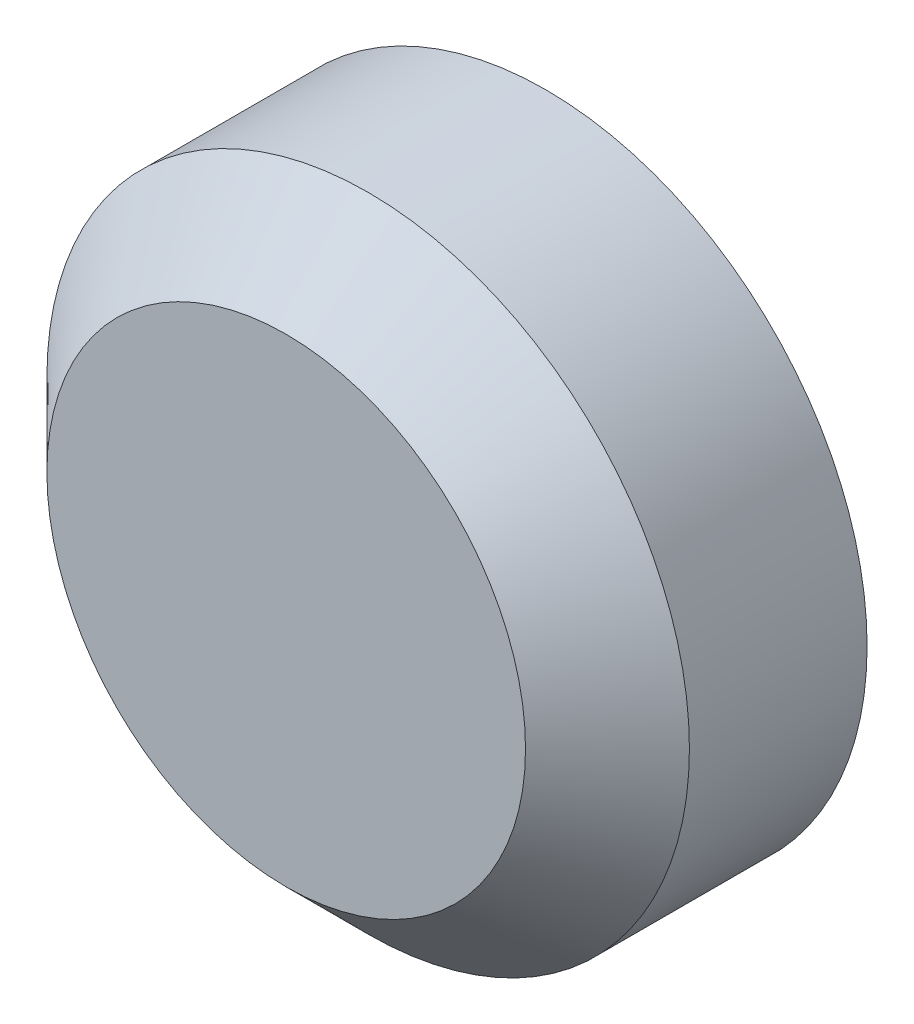
ISO-10303-21;
HEADER;
FILE_DESCRIPTION(('STEP AP214'),'2;1');
FILE_NAME('part.step','',(''),(''),'','','');
FILE_SCHEMA(('AUTOMOTIVE_DESIGN { 1 0 10303 214 1 1 1 1 }'));
ENDSEC;
DATA;
#1=APPLICATION_CONTEXT('core data for automotive mechanical design processes');
#2=APPLICATION_PROTOCOL_DEFINITION('international standard','automotive_design',2000,#1);
#3=PRODUCT_CONTEXT('',#1,'mechanical');
#4=PRODUCT('Part','Part','',(#3));
#5=PRODUCT_RELATED_PRODUCT_CATEGORY('part','',(#4));
#6=PRODUCT_DEFINITION_FORMATION('','',#4);
#7=PRODUCT_DEFINITION_CONTEXT('part definition',#1,'design');
#8=PRODUCT_DEFINITION('design','',#6,#7);
#9=PRODUCT_DEFINITION_SHAPE('','',#8);
#10=(LENGTH_UNIT() NAMED_UNIT(*) SI_UNIT(.MILLI.,.METRE.));
#11=(NAMED_UNIT(*) PLANE_ANGLE_UNIT() SI_UNIT($,.RADIAN.));
#12=(NAMED_UNIT(*) SI_UNIT($,.STERADIAN.) SOLID_ANGLE_UNIT());
#13=UNCERTAINTY_MEASURE_WITH_UNIT(LENGTH_MEASURE(1.E-05),#10,'distance_accuracy_value','');
#14=(GEOMETRIC_REPRESENTATION_CONTEXT(3) GLOBAL_UNCERTAINTY_ASSIGNED_CONTEXT((#13)) GLOBAL_UNIT_ASSIGNED_CONTEXT((#10,
#11,#12)) REPRESENTATION_CONTEXT('',''));
#15=CARTESIAN_POINT('',(0.,0.,0.));
#16=DIRECTION('',(0.,0.,1.));
#17=DIRECTION('',(1.,0.,0.));
#18=AXIS2_PLACEMENT_3D('',#15,#16,#17);
#19=CARTESIAN_POINT('',(0.,0.,5.0292));
#20=DIRECTION('',(0.,0.,-1.));
#21=DIRECTION('',(-1.,0.,0.));
#22=AXIS2_PLACEMENT_3D('',#19,#20,#21);
#23=CYLINDRICAL_SURFACE('',#22,6.223);
#24=CARTESIAN_POINT('',(0.,0.,3.4417));
#25=DIRECTION('',(0.,0.,1.));
#26=DIRECTION('',(1.,0.,0.));
#27=AXIS2_PLACEMENT_3D('',#24,#25,#26);
#28=CIRCLE('',#27,6.223);
#29=CARTESIAN_POINT('',(-6.223,0.,3.4417));
#30=VERTEX_POINT('',#29);
#31=EDGE_CURVE('E10',#30,#30,#28,.F.);
#32=ORIENTED_EDGE('',*,*,#31,.T.);
#33=EDGE_LOOP('',(#32));
#34=FACE_BOUND('',#33,.T.);
#35=CARTESIAN_POINT('',(0.,0.,0.));
#36=DIRECTION('',(0.,0.,1.));
#37=DIRECTION('',(1.,0.,0.));
#38=AXIS2_PLACEMENT_3D('',#35,#36,#37);
#39=CIRCLE('',#38,6.223);
#40=CARTESIAN_POINT('',(6.223,0.,0.));
#41=VERTEX_POINT('',#40);
#42=EDGE_CURVE('E50',#41,#41,#39,.T.);
#43=ORIENTED_EDGE('',*,*,#42,.T.);
#44=EDGE_LOOP('',(#43));
#45=FACE_BOUND('',#44,.T.);
#46=ADVANCED_FACE('F38',(#34,#45),#23,.T.);
#47=CARTESIAN_POINT('',(0.,0.,5.0292));
#48=DIRECTION('',(0.,0.,1.));
#49=DIRECTION('',(1.,0.,0.));
#50=AXIS2_PLACEMENT_3D('',#47,#48,#49);
#51=PLANE('',#50);
#52=CARTESIAN_POINT('',(0.,0.,5.0292));
#53=DIRECTION('',(0.,0.,1.));
#54=DIRECTION('',(1.,0.,0.));
#55=AXIS2_PLACEMENT_3D('',#52,#53,#54);
#56=CIRCLE('',#55,4.6355);
#57=CARTESIAN_POINT('',(-4.6355,0.,5.0292));
#58=VERTEX_POINT('',#57);
#59=EDGE_CURVE('E46',#58,#58,#56,.T.);
#60=ORIENTED_EDGE('',*,*,#59,.T.);
#61=EDGE_LOOP('',(#60));
#62=FACE_BOUND('',#61,.T.);
#63=ADVANCED_FACE('F60',(#62),#51,.T.);
#64=CARTESIAN_POINT('',(0.,0.,0.));
#65=DIRECTION('',(0.,0.,1.));
#66=DIRECTION('',(1.,0.,0.));
#67=AXIS2_PLACEMENT_3D('',#64,#65,#66);
#68=PLANE('',#67);
#69=ORIENTED_EDGE('',*,*,#42,.F.);
#70=EDGE_LOOP('',(#69));
#71=FACE_BOUND('',#70,.T.);
#72=ADVANCED_FACE('F58',(#71),#68,.F.);
#73=CARTESIAN_POINT('',(0.,0.,5.0292));
#74=DIRECTION('',(0.,0.,-1.));
#75=DIRECTION('',(-1.,0.,0.));
#76=AXIS2_PLACEMENT_3D('',#73,#74,#75);
#77=CONICAL_SURFACE('',#76,4.6355,0.785398163397446);
#78=CARTESIAN_POINT('',(-6.223,0.,3.4417));
#79=CARTESIAN_POINT('',(-6.20646354166667,0.,3.45823645833333));
#80=CARTESIAN_POINT('',(-6.18992708333333,0.,3.47477291666666));
#81=CARTESIAN_POINT('',(-6.15685416666667,0.,3.50784583333333));
#82=CARTESIAN_POINT('',(-6.14031770833333,0.,3.52438229166666));
#83=CARTESIAN_POINT('',(-6.10724479166667,0.,3.55745520833333));
#84=CARTESIAN_POINT('',(-6.09070833333333,0.,3.57399166666666));
#85=CARTESIAN_POINT('',(-6.05763541666667,0.,3.60706458333333));
#86=CARTESIAN_POINT('',(-6.04109895833333,0.,3.62360104166666));
#87=CARTESIAN_POINT('',(-6.00802604166667,0.,3.65667395833333));
#88=CARTESIAN_POINT('',(-5.99148958333333,0.,3.67321041666666));
#89=CARTESIAN_POINT('',(-5.95841666666667,0.,3.70628333333333));
#90=CARTESIAN_POINT('',(-5.94188020833333,0.,3.72281979166666));
#91=CARTESIAN_POINT('',(-5.90880729166667,0.,3.75589270833333));
#92=CARTESIAN_POINT('',(-5.89227083333333,0.,3.77242916666666));
#93=CARTESIAN_POINT('',(-5.85919791666667,0.,3.80550208333333));
#94=CARTESIAN_POINT('',(-5.84266145833333,0.,3.82203854166666));
#95=CARTESIAN_POINT('',(-5.80958854166667,0.,3.85511145833333));
#96=CARTESIAN_POINT('',(-5.79305208333333,0.,3.87164791666666));
#97=CARTESIAN_POINT('',(-5.75997916666667,0.,3.90472083333333));
#98=CARTESIAN_POINT('',(-5.74344270833333,0.,3.92125729166666));
#99=CARTESIAN_POINT('',(-5.71036979166667,0.,3.95433020833333));
#100=CARTESIAN_POINT('',(-5.69383333333333,0.,3.97086666666666));
#101=CARTESIAN_POINT('',(-5.66076041666667,0.,4.00393958333333));
#102=CARTESIAN_POINT('',(-5.64422395833333,0.,4.02047604166666));
#103=CARTESIAN_POINT('',(-5.61115104166667,0.,4.05354895833333));
#104=CARTESIAN_POINT('',(-5.59461458333333,0.,4.07008541666666));
#105=CARTESIAN_POINT('',(-5.56154166666667,0.,4.10315833333333));
#106=CARTESIAN_POINT('',(-5.54500520833333,0.,4.11969479166666));
#107=CARTESIAN_POINT('',(-5.51193229166667,0.,4.15276770833333));
#108=CARTESIAN_POINT('',(-5.49539583333334,0.,4.16930416666666));
#109=CARTESIAN_POINT('',(-5.46232291666667,0.,4.20237708333333));
#110=CARTESIAN_POINT('',(-5.44578645833333,0.,4.21891354166666));
#111=CARTESIAN_POINT('',(-5.41271354166667,0.,4.25198645833333));
#112=CARTESIAN_POINT('',(-5.39617708333333,0.,4.26852291666667));
#113=CARTESIAN_POINT('',(-5.36310416666667,0.,4.30159583333333));
#114=CARTESIAN_POINT('',(-5.34656770833333,0.,4.31813229166666));
#115=CARTESIAN_POINT('',(-5.31349479166667,0.,4.35120520833333));
#116=CARTESIAN_POINT('',(-5.29695833333334,0.,4.36774166666667));
#117=CARTESIAN_POINT('',(-5.26388541666667,0.,4.40081458333333));
#118=CARTESIAN_POINT('',(-5.24734895833334,0.,4.41735104166666));
#119=CARTESIAN_POINT('',(-5.21427604166667,0.,4.45042395833333));
#120=CARTESIAN_POINT('',(-5.19773958333334,0.,4.46696041666667));
#121=CARTESIAN_POINT('',(-5.16466666666667,0.,4.50003333333333));
#122=CARTESIAN_POINT('',(-5.14813020833333,0.,4.51656979166667));
#123=CARTESIAN_POINT('',(-5.11505729166667,0.,4.54964270833333));
#124=CARTESIAN_POINT('',(-5.09852083333334,0.,4.56617916666667));
#125=CARTESIAN_POINT('',(-5.06544791666667,0.,4.59925208333333));
#126=CARTESIAN_POINT('',(-5.04891145833334,0.,4.61578854166667));
#127=CARTESIAN_POINT('',(-5.01583854166667,0.,4.64886145833333));
#128=CARTESIAN_POINT('',(-4.99930208333334,0.,4.66539791666667));
#129=CARTESIAN_POINT('',(-4.96622916666667,0.,4.69847083333333));
#130=CARTESIAN_POINT('',(-4.94969270833334,0.,4.71500729166667));
#131=CARTESIAN_POINT('',(-4.91661979166667,0.,4.74808020833333));
#132=CARTESIAN_POINT('',(-4.90008333333334,0.,4.76461666666667));
#133=CARTESIAN_POINT('',(-4.86701041666667,0.,4.79768958333333));
#134=CARTESIAN_POINT('',(-4.85047395833334,0.,4.81422604166667));
#135=CARTESIAN_POINT('',(-4.81740104166667,0.,4.84729895833333));
#136=CARTESIAN_POINT('',(-4.80086458333334,0.,4.86383541666667));
#137=CARTESIAN_POINT('',(-4.76779166666667,0.,4.89690833333333));
#138=CARTESIAN_POINT('',(-4.75125520833334,0.,4.91344479166667));
#139=CARTESIAN_POINT('',(-4.71818229166667,0.,4.94651770833333));
#140=CARTESIAN_POINT('',(-4.70164583333334,0.,4.96305416666667));
#141=CARTESIAN_POINT('',(-4.66857291666667,0.,4.99612708333333));
#142=CARTESIAN_POINT('',(-4.65203645833334,0.,5.01266354166667));
#143=CARTESIAN_POINT('',(-4.6355,0.,5.0292));
#144=B_SPLINE_CURVE_WITH_KNOTS('',3,(#78,#79,#80,#81,#82,#83,#84,#85,#86,#87,#88,#89,#90,#91,
#92,#93,#94,#95,#96,#97,#98,#99,#100,#101,#102,#103,#104,#105,#106,#107,#108,#109,#110,#111,
#112,#113,#114,#115,#116,#117,#118,#119,#120,#121,#122,#123,#124,#125,#126,#127,#128,#129,#130,
#131,#132,#133,#134,#135,#136,#137,#138,#139,#140,#141,#142,#143),.UNSPECIFIED.,.F.,.F.,(4,2,2,
2,2,2,2,2,2,2,2,2,2,2,2,2,2,2,2,2,2,2,2,2,2,2,2,2,2,2,2,2,4),(0.,0.070158250945853,
0.140316501891706,0.210474752837559,0.280633003783411,0.350791254729264,0.420949505675117,
0.49110775662097,0.561266007566822,0.631424258512675,0.701582509458528,0.771740760404381,
0.841899011350234,0.912057262296087,0.982215513241939,1.05237376418779,1.12253201513364,
1.1926902660795,1.26284851702535,1.3330067679712,1.40316501891706,1.47332326986291,
1.54348152080876,1.61363977175461,1.68379802270047,1.75395627364632,1.82411452459217,
1.89427277553803,1.96443102648388,2.03458927742973,2.10474752837558,2.17490577932144,
2.24506403026729),.UNSPECIFIED.);
#145=EDGE_CURVE('BSEAM41',#30,#58,#144,.T.);
#146=ORIENTED_EDGE('',*,*,#31,.F.);
#147=ORIENTED_EDGE('',*,*,#59,.F.);
#148=ORIENTED_EDGE('',*,*,#145,.T.);
#149=ORIENTED_EDGE('',*,*,#145,.F.);
#150=EDGE_LOOP('',(#146,#148,#147,#149));
#151=FACE_BOUND('',#150,.T.);
#152=ADVANCED_FACE('F41',(#151),#77,.T.);
#153=CLOSED_SHELL('',(#46,#63,#72,#152));
#154=MANIFOLD_SOLID_BREP('B2',#153);
#155=ADVANCED_BREP_SHAPE_REPRESENTATION('',(#18,#154),#14);
#156=SHAPE_DEFINITION_REPRESENTATION(#9,#155);
ENDSEC;
END-ISO-10303-21;
